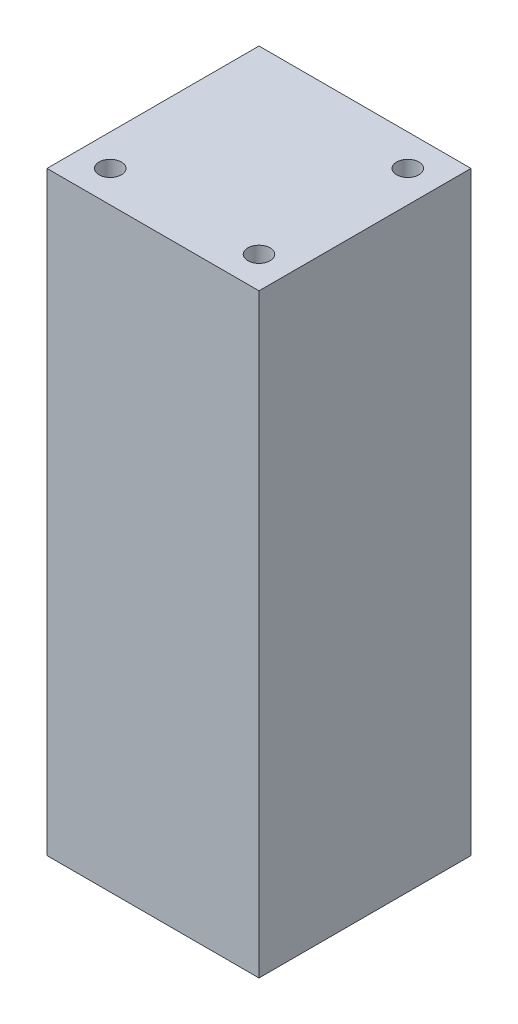
ISO-10303-21;
HEADER;
FILE_DESCRIPTION(('STEP AP214'),'2;1');
FILE_NAME('part.step','',(''),(''),'','','');
FILE_SCHEMA(('AUTOMOTIVE_DESIGN { 1 0 10303 214 1 1 1 1 }'));
ENDSEC;
DATA;
#1=APPLICATION_CONTEXT('core data for automotive mechanical design processes');
#2=APPLICATION_PROTOCOL_DEFINITION('international standard','automotive_design',2000,#1);
#3=PRODUCT_CONTEXT('',#1,'mechanical');
#4=PRODUCT('Part','Part','',(#3));
#5=PRODUCT_RELATED_PRODUCT_CATEGORY('part','',(#4));
#6=PRODUCT_DEFINITION_FORMATION('','',#4);
#7=PRODUCT_DEFINITION_CONTEXT('part definition',#1,'design');
#8=PRODUCT_DEFINITION('design','',#6,#7);
#9=PRODUCT_DEFINITION_SHAPE('','',#8);
#10=(LENGTH_UNIT() NAMED_UNIT(*) SI_UNIT(.MILLI.,.METRE.));
#11=(NAMED_UNIT(*) PLANE_ANGLE_UNIT() SI_UNIT($,.RADIAN.));
#12=(NAMED_UNIT(*) SI_UNIT($,.STERADIAN.) SOLID_ANGLE_UNIT());
#13=UNCERTAINTY_MEASURE_WITH_UNIT(LENGTH_MEASURE(1.E-05),#10,'distance_accuracy_value','');
#14=(GEOMETRIC_REPRESENTATION_CONTEXT(3) GLOBAL_UNCERTAINTY_ASSIGNED_CONTEXT((#13)) GLOBAL_UNIT_ASSIGNED_CONTEXT((#10,
#11,#12)) REPRESENTATION_CONTEXT('',''));
#15=CARTESIAN_POINT('',(0.,0.,0.));
#16=DIRECTION('',(0.,0.,1.));
#17=DIRECTION('',(1.,0.,0.));
#18=AXIS2_PLACEMENT_3D('',#15,#16,#17);
#19=CARTESIAN_POINT('',(14.25,80.,-14.25));
#20=DIRECTION('',(-1.,0.,0.));
#21=DIRECTION('',(0.,0.,1.));
#22=AXIS2_PLACEMENT_3D('',#19,#20,#21);
#23=PLANE('',#22);
#24=DIRECTION('',(0.,0.,-1.));
#25=VECTOR('',#24,1.);
#26=CARTESIAN_POINT('',(14.25,0.,-14.25));
#27=LINE('',#26,#25);
#28=CARTESIAN_POINT('',(14.25,0.,14.25));
#29=VERTEX_POINT('',#28);
#30=CARTESIAN_POINT('',(14.25,0.,-14.25));
#31=VERTEX_POINT('',#30);
#32=EDGE_CURVE('E107',#29,#31,#27,.T.);
#33=ORIENTED_EDGE('',*,*,#32,.T.);
#34=DIRECTION('',(0.,-1.,0.));
#35=VECTOR('',#34,1.);
#36=CARTESIAN_POINT('',(14.25,80.,-14.25));
#37=LINE('',#36,#35);
#38=CARTESIAN_POINT('',(14.25,80.,-14.25));
#39=VERTEX_POINT('',#38);
#40=EDGE_CURVE('E11',#39,#31,#37,.T.);
#41=ORIENTED_EDGE('',*,*,#40,.F.);
#42=DIRECTION('',(0.,0.,-1.));
#43=VECTOR('',#42,1.);
#44=CARTESIAN_POINT('',(14.25,80.,-14.25));
#45=LINE('',#44,#43);
#46=CARTESIAN_POINT('',(14.25,80.,14.25));
#47=VERTEX_POINT('',#46);
#48=EDGE_CURVE('E91',#47,#39,#45,.T.);
#49=ORIENTED_EDGE('',*,*,#48,.F.);
#50=DIRECTION('',(0.,-1.,0.));
#51=VECTOR('',#50,1.);
#52=CARTESIAN_POINT('',(14.25,80.,14.25));
#53=LINE('',#52,#51);
#54=EDGE_CURVE('E103',#47,#29,#53,.T.);
#55=ORIENTED_EDGE('',*,*,#54,.T.);
#56=EDGE_LOOP('',(#33,#41,#49,#55));
#57=FACE_BOUND('',#56,.T.);
#58=ADVANCED_FACE('F39',(#57),#23,.F.);
#59=CARTESIAN_POINT('',(-14.25,80.,-14.25));
#60=DIRECTION('',(0.,0.,1.));
#61=DIRECTION('',(1.,0.,0.));
#62=AXIS2_PLACEMENT_3D('',#59,#60,#61);
#63=PLANE('',#62);
#64=DIRECTION('',(-1.,0.,0.));
#65=VECTOR('',#64,1.);
#66=CARTESIAN_POINT('',(-14.25,0.,-14.25));
#67=LINE('',#66,#65);
#68=CARTESIAN_POINT('',(-14.25,0.,-14.25));
#69=VERTEX_POINT('',#68);
#70=EDGE_CURVE('E96',#31,#69,#67,.T.);
#71=ORIENTED_EDGE('',*,*,#70,.T.);
#72=DIRECTION('',(0.,-1.,0.));
#73=VECTOR('',#72,1.);
#74=CARTESIAN_POINT('',(-14.25,80.,-14.25));
#75=LINE('',#74,#73);
#76=CARTESIAN_POINT('',(-14.25,80.,-14.25));
#77=VERTEX_POINT('',#76);
#78=EDGE_CURVE('E48',#77,#69,#75,.T.);
#79=ORIENTED_EDGE('',*,*,#78,.F.);
#80=DIRECTION('',(-1.,0.,0.));
#81=VECTOR('',#80,1.);
#82=CARTESIAN_POINT('',(-14.25,80.,-14.25));
#83=LINE('',#82,#81);
#84=EDGE_CURVE('E86',#39,#77,#83,.T.);
#85=ORIENTED_EDGE('',*,*,#84,.F.);
#86=ORIENTED_EDGE('',*,*,#40,.T.);
#87=EDGE_LOOP('',(#71,#79,#85,#86));
#88=FACE_BOUND('',#87,.T.);
#89=ADVANCED_FACE('F95',(#88),#63,.F.);
#90=CARTESIAN_POINT('',(-14.25,80.,-14.25));
#91=DIRECTION('',(1.,0.,0.));
#92=DIRECTION('',(0.,0.,-1.));
#93=AXIS2_PLACEMENT_3D('',#90,#91,#92);
#94=PLANE('',#93);
#95=DIRECTION('',(0.,0.,1.));
#96=VECTOR('',#95,1.);
#97=CARTESIAN_POINT('',(-14.25,0.,-14.25));
#98=LINE('',#97,#96);
#99=CARTESIAN_POINT('',(-14.25,0.,14.25));
#100=VERTEX_POINT('',#99);
#101=EDGE_CURVE('E73',#69,#100,#98,.T.);
#102=ORIENTED_EDGE('',*,*,#101,.T.);
#103=DIRECTION('',(0.,-1.,0.));
#104=VECTOR('',#103,1.);
#105=CARTESIAN_POINT('',(-14.25,80.,14.25));
#106=LINE('',#105,#104);
#107=CARTESIAN_POINT('',(-14.25,80.,14.25));
#108=VERTEX_POINT('',#107);
#109=EDGE_CURVE('E98',#108,#100,#106,.T.);
#110=ORIENTED_EDGE('',*,*,#109,.F.);
#111=DIRECTION('',(0.,0.,1.));
#112=VECTOR('',#111,1.);
#113=CARTESIAN_POINT('',(-14.25,80.,-14.25));
#114=LINE('',#113,#112);
#115=EDGE_CURVE('E89',#77,#108,#114,.T.);
#116=ORIENTED_EDGE('',*,*,#115,.F.);
#117=ORIENTED_EDGE('',*,*,#78,.T.);
#118=EDGE_LOOP('',(#102,#110,#116,#117));
#119=FACE_BOUND('',#118,.T.);
#120=ADVANCED_FACE('F99',(#119),#94,.F.);
#121=CARTESIAN_POINT('',(-14.25,80.,14.25));
#122=DIRECTION('',(0.,0.,-1.));
#123=DIRECTION('',(-1.,0.,0.));
#124=AXIS2_PLACEMENT_3D('',#121,#122,#123);
#125=PLANE('',#124);
#126=DIRECTION('',(1.,0.,0.));
#127=VECTOR('',#126,1.);
#128=CARTESIAN_POINT('',(-14.25,0.,14.25));
#129=LINE('',#128,#127);
#130=EDGE_CURVE('E79',#100,#29,#129,.T.);
#131=ORIENTED_EDGE('',*,*,#130,.T.);
#132=ORIENTED_EDGE('',*,*,#54,.F.);
#133=DIRECTION('',(1.,0.,0.));
#134=VECTOR('',#133,1.);
#135=CARTESIAN_POINT('',(-14.25,80.,14.25));
#136=LINE('',#135,#134);
#137=EDGE_CURVE('E56',#108,#47,#136,.T.);
#138=ORIENTED_EDGE('',*,*,#137,.F.);
#139=ORIENTED_EDGE('',*,*,#109,.T.);
#140=EDGE_LOOP('',(#131,#132,#138,#139));
#141=FACE_BOUND('',#140,.T.);
#142=ADVANCED_FACE('F121',(#141),#125,.F.);
#143=CARTESIAN_POINT('',(0.,80.,0.));
#144=DIRECTION('',(0.,1.,0.));
#145=DIRECTION('',(0.,0.,1.));
#146=AXIS2_PLACEMENT_3D('',#143,#144,#145);
#147=PLANE('',#146);
#148=CARTESIAN_POINT('',(10.,80.,-10.));
#149=DIRECTION('',(0.,1.,0.));
#150=DIRECTION('',(0.,0.,1.));
#151=AXIS2_PLACEMENT_3D('',#148,#149,#150);
#152=CIRCLE('',#151,1.5);
#153=CARTESIAN_POINT('',(10.,80.,-8.5));
#154=VERTEX_POINT('',#153);
#155=EDGE_CURVE('E144',#154,#154,#152,.T.);
#156=ORIENTED_EDGE('',*,*,#155,.F.);
#157=EDGE_LOOP('',(#156));
#158=FACE_BOUND('',#157,.T.);
#159=CARTESIAN_POINT('',(10.,80.,10.));
#160=DIRECTION('',(0.,1.,0.));
#161=DIRECTION('',(0.,0.,1.));
#162=AXIS2_PLACEMENT_3D('',#159,#160,#161);
#163=CIRCLE('',#162,1.5);
#164=CARTESIAN_POINT('',(10.,80.,11.5));
#165=VERTEX_POINT('',#164);
#166=EDGE_CURVE('E136',#165,#165,#163,.T.);
#167=ORIENTED_EDGE('',*,*,#166,.F.);
#168=EDGE_LOOP('',(#167));
#169=FACE_BOUND('',#168,.T.);
#170=CARTESIAN_POINT('',(-10.,80.,10.));
#171=DIRECTION('',(0.,1.,0.));
#172=DIRECTION('',(0.,0.,1.));
#173=AXIS2_PLACEMENT_3D('',#170,#171,#172);
#174=CIRCLE('',#173,1.5);
#175=CARTESIAN_POINT('',(-10.,80.,11.5));
#176=VERTEX_POINT('',#175);
#177=EDGE_CURVE('E128',#176,#176,#174,.T.);
#178=ORIENTED_EDGE('',*,*,#177,.F.);
#179=EDGE_LOOP('',(#178));
#180=FACE_BOUND('',#179,.T.);
#181=ORIENTED_EDGE('',*,*,#48,.T.);
#182=ORIENTED_EDGE('',*,*,#84,.T.);
#183=ORIENTED_EDGE('',*,*,#115,.T.);
#184=ORIENTED_EDGE('',*,*,#137,.T.);
#185=EDGE_LOOP('',(#181,#182,#183,#184));
#186=FACE_BOUND('',#185,.T.);
#187=ADVANCED_FACE('F87',(#158,#169,#180,#186),#147,.T.);
#188=CARTESIAN_POINT('',(0.,0.,0.));
#189=DIRECTION('',(0.,1.,0.));
#190=DIRECTION('',(0.,0.,1.));
#191=AXIS2_PLACEMENT_3D('',#188,#189,#190);
#192=PLANE('',#191);
#193=ORIENTED_EDGE('',*,*,#32,.F.);
#194=ORIENTED_EDGE('',*,*,#130,.F.);
#195=ORIENTED_EDGE('',*,*,#101,.F.);
#196=ORIENTED_EDGE('',*,*,#70,.F.);
#197=EDGE_LOOP('',(#193,#194,#195,#196));
#198=FACE_BOUND('',#197,.T.);
#199=ADVANCED_FACE('F124',(#198),#192,.F.);
#200=CARTESIAN_POINT('',(-10.,68.,10.));
#201=DIRECTION('',(0.,1.,0.));
#202=DIRECTION('',(0.,0.,1.));
#203=AXIS2_PLACEMENT_3D('',#200,#201,#202);
#204=CYLINDRICAL_SURFACE('',#203,1.5);
#205=CARTESIAN_POINT('',(-10.,68.,10.));
#206=DIRECTION('',(0.,1.,0.));
#207=DIRECTION('',(0.,0.,1.));
#208=AXIS2_PLACEMENT_3D('',#205,#206,#207);
#209=CIRCLE('',#208,1.5);
#210=CARTESIAN_POINT('',(-10.,68.,11.5));
#211=VERTEX_POINT('',#210);
#212=EDGE_CURVE('E132',#211,#211,#209,.T.);
#213=ORIENTED_EDGE('',*,*,#212,.F.);
#214=EDGE_LOOP('',(#213));
#215=FACE_BOUND('',#214,.T.);
#216=ORIENTED_EDGE('',*,*,#177,.T.);
#217=EDGE_LOOP('',(#216));
#218=FACE_BOUND('',#217,.T.);
#219=ADVANCED_FACE('F168',(#215,#218),#204,.F.);
#220=CARTESIAN_POINT('',(-10.,68.,10.));
#221=DIRECTION('',(0.,1.,0.));
#222=DIRECTION('',(0.,0.,1.));
#223=AXIS2_PLACEMENT_3D('',#220,#221,#222);
#224=PLANE('',#223);
#225=ORIENTED_EDGE('',*,*,#212,.T.);
#226=EDGE_LOOP('',(#225));
#227=FACE_BOUND('',#226,.T.);
#228=ADVANCED_FACE('F170',(#227),#224,.T.);
#229=CARTESIAN_POINT('',(10.,68.,10.));
#230=DIRECTION('',(0.,1.,0.));
#231=DIRECTION('',(0.,0.,1.));
#232=AXIS2_PLACEMENT_3D('',#229,#230,#231);
#233=CYLINDRICAL_SURFACE('',#232,1.5);
#234=CARTESIAN_POINT('',(10.,68.,10.));
#235=DIRECTION('',(0.,1.,0.));
#236=DIRECTION('',(0.,0.,1.));
#237=AXIS2_PLACEMENT_3D('',#234,#235,#236);
#238=CIRCLE('',#237,1.5);
#239=CARTESIAN_POINT('',(10.,68.,11.5));
#240=VERTEX_POINT('',#239);
#241=EDGE_CURVE('E140',#240,#240,#238,.T.);
#242=ORIENTED_EDGE('',*,*,#241,.F.);
#243=EDGE_LOOP('',(#242));
#244=FACE_BOUND('',#243,.T.);
#245=ORIENTED_EDGE('',*,*,#166,.T.);
#246=EDGE_LOOP('',(#245));
#247=FACE_BOUND('',#246,.T.);
#248=ADVANCED_FACE('F177',(#244,#247),#233,.F.);
#249=CARTESIAN_POINT('',(10.,68.,10.));
#250=DIRECTION('',(0.,1.,0.));
#251=DIRECTION('',(0.,0.,1.));
#252=AXIS2_PLACEMENT_3D('',#249,#250,#251);
#253=PLANE('',#252);
#254=ORIENTED_EDGE('',*,*,#241,.T.);
#255=EDGE_LOOP('',(#254));
#256=FACE_BOUND('',#255,.T.);
#257=ADVANCED_FACE('F157',(#256),#253,.T.);
#258=CARTESIAN_POINT('',(10.,68.,-10.));
#259=DIRECTION('',(0.,1.,0.));
#260=DIRECTION('',(0.,0.,1.));
#261=AXIS2_PLACEMENT_3D('',#258,#259,#260);
#262=CYLINDRICAL_SURFACE('',#261,1.5);
#263=CARTESIAN_POINT('',(10.,68.,-10.));
#264=DIRECTION('',(0.,1.,0.));
#265=DIRECTION('',(0.,0.,1.));
#266=AXIS2_PLACEMENT_3D('',#263,#264,#265);
#267=CIRCLE('',#266,1.5);
#268=CARTESIAN_POINT('',(10.,68.,-8.5));
#269=VERTEX_POINT('',#268);
#270=EDGE_CURVE('E111',#269,#269,#267,.T.);
#271=ORIENTED_EDGE('',*,*,#270,.F.);
#272=EDGE_LOOP('',(#271));
#273=FACE_BOUND('',#272,.T.);
#274=ORIENTED_EDGE('',*,*,#155,.T.);
#275=EDGE_LOOP('',(#274));
#276=FACE_BOUND('',#275,.T.);
#277=ADVANCED_FACE('F154',(#273,#276),#262,.F.);
#278=CARTESIAN_POINT('',(10.,68.,-10.));
#279=DIRECTION('',(0.,1.,0.));
#280=DIRECTION('',(0.,0.,1.));
#281=AXIS2_PLACEMENT_3D('',#278,#279,#280);
#282=PLANE('',#281);
#283=ORIENTED_EDGE('',*,*,#270,.T.);
#284=EDGE_LOOP('',(#283));
#285=FACE_BOUND('',#284,.T.);
#286=ADVANCED_FACE('F152',(#285),#282,.T.);
#287=CLOSED_SHELL('',(#58,#89,#120,#142,#187,#199,#219,#228,#248,#257,#277,#286));
#288=MANIFOLD_SOLID_BREP('B2',#287);
#289=ADVANCED_BREP_SHAPE_REPRESENTATION('',(#18,#288),#14);
#290=SHAPE_DEFINITION_REPRESENTATION(#9,#289);
ENDSEC;
END-ISO-10303-21;
